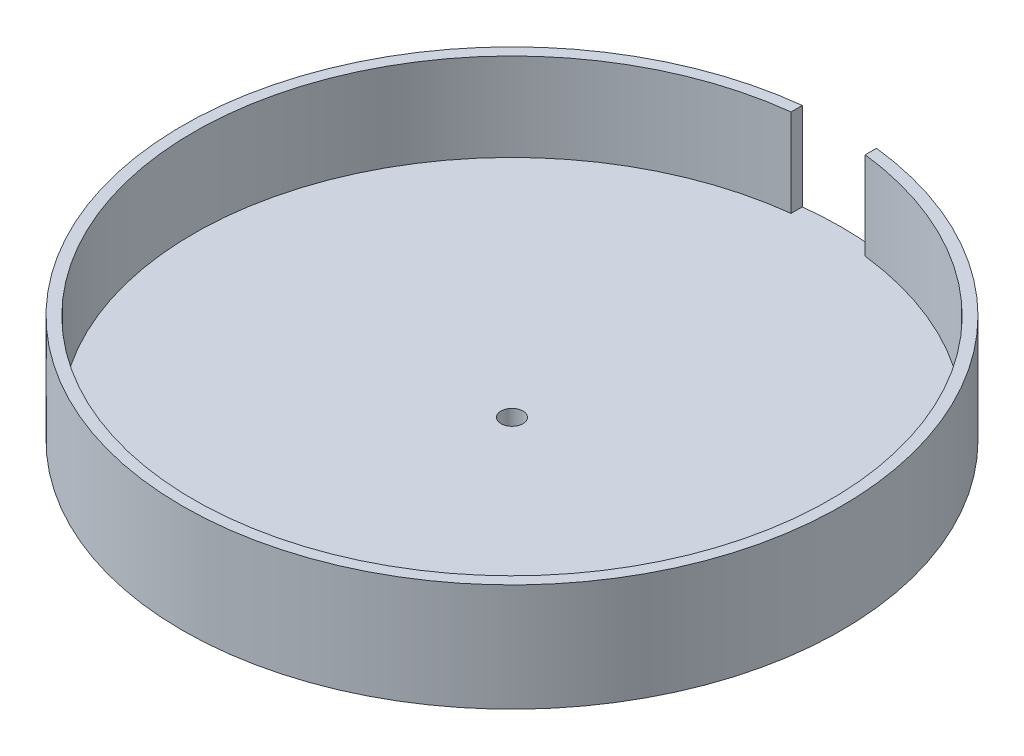
ISO-10303-21;
HEADER;
FILE_DESCRIPTION(('STEP AP214'),'2;1');
FILE_NAME('part.step','',(''),(''),'','','');
FILE_SCHEMA(('AUTOMOTIVE_DESIGN { 1 0 10303 214 1 1 1 1 }'));
ENDSEC;
DATA;
#1=APPLICATION_CONTEXT('core data for automotive mechanical design processes');
#2=APPLICATION_PROTOCOL_DEFINITION('international standard','automotive_design',2000,#1);
#3=PRODUCT_CONTEXT('',#1,'mechanical');
#4=PRODUCT('Part','Part','',(#3));
#5=PRODUCT_RELATED_PRODUCT_CATEGORY('part','',(#4));
#6=PRODUCT_DEFINITION_FORMATION('','',#4);
#7=PRODUCT_DEFINITION_CONTEXT('part definition',#1,'design');
#8=PRODUCT_DEFINITION('design','',#6,#7);
#9=PRODUCT_DEFINITION_SHAPE('','',#8);
#10=(LENGTH_UNIT() NAMED_UNIT(*) SI_UNIT(.MILLI.,.METRE.));
#11=(NAMED_UNIT(*) PLANE_ANGLE_UNIT() SI_UNIT($,.RADIAN.));
#12=(NAMED_UNIT(*) SI_UNIT($,.STERADIAN.) SOLID_ANGLE_UNIT());
#13=UNCERTAINTY_MEASURE_WITH_UNIT(LENGTH_MEASURE(1.E-05),#10,'distance_accuracy_value','');
#14=(GEOMETRIC_REPRESENTATION_CONTEXT(3) GLOBAL_UNCERTAINTY_ASSIGNED_CONTEXT((#13)) GLOBAL_UNIT_ASSIGNED_CONTEXT((#10,
#11,#12)) REPRESENTATION_CONTEXT('',''));
#15=CARTESIAN_POINT('',(0.,0.,0.));
#16=DIRECTION('',(0.,0.,1.));
#17=DIRECTION('',(1.,0.,0.));
#18=AXIS2_PLACEMENT_3D('',#15,#16,#17);
#19=CARTESIAN_POINT('',(0.,0.,0.));
#20=DIRECTION('',(0.,1.,0.));
#21=DIRECTION('',(0.,0.,1.));
#22=AXIS2_PLACEMENT_3D('',#19,#20,#21);
#23=PLANE('',#22);
#24=CARTESIAN_POINT('',(0.,0.,0.));
#25=DIRECTION('',(0.,1.,0.));
#26=DIRECTION('',(0.,0.,1.));
#27=AXIS2_PLACEMENT_3D('',#24,#25,#26);
#28=CIRCLE('',#27,150.);
#29=CARTESIAN_POINT('',(0.,0.,150.));
#30=VERTEX_POINT('',#29);
#31=EDGE_CURVE('E12',#30,#30,#28,.T.);
#32=ORIENTED_EDGE('',*,*,#31,.F.);
#33=EDGE_LOOP('',(#32));
#34=FACE_BOUND('',#33,.T.);
#35=CARTESIAN_POINT('',(0.,0.,0.));
#36=DIRECTION('',(0.,1.,0.));
#37=DIRECTION('',(0.,0.,1.));
#38=AXIS2_PLACEMENT_3D('',#35,#36,#37);
#39=CIRCLE('',#38,5.);
#40=CARTESIAN_POINT('',(0.,0.,5.));
#41=VERTEX_POINT('',#40);
#42=EDGE_CURVE('E55',#41,#41,#39,.T.);
#43=ORIENTED_EDGE('',*,*,#42,.T.);
#44=EDGE_LOOP('',(#43));
#45=FACE_BOUND('',#44,.T.);
#46=ADVANCED_FACE('F42',(#34,#45),#23,.F.);
#47=CARTESIAN_POINT('',(0.,8.99999999999997,0.));
#48=DIRECTION('',(0.,-1.,0.));
#49=DIRECTION('',(0.,0.,-1.));
#50=AXIS2_PLACEMENT_3D('',#47,#48,#49);
#51=CYLINDRICAL_SURFACE('',#50,150.);
#52=ORIENTED_EDGE('',*,*,#31,.T.);
#53=EDGE_LOOP('',(#52));
#54=FACE_BOUND('',#53,.T.);
#55=CARTESIAN_POINT('',(0.,8.99999999999997,0.));
#56=DIRECTION('',(0.,1.,0.));
#57=DIRECTION('',(0.,0.,1.));
#58=AXIS2_PLACEMENT_3D('',#55,#56,#57);
#59=CIRCLE('',#58,150.);
#60=CARTESIAN_POINT('',(16.8870802316767,8.99999999999997,-149.046390500572));
#61=VERTEX_POINT('',#60);
#62=CARTESIAN_POINT('',(-16.8870802316767,8.99999999999997,-149.046390500572));
#63=VERTEX_POINT('',#62);
#64=EDGE_CURVE('E95',#61,#63,#59,.T.);
#65=ORIENTED_EDGE('',*,*,#64,.F.);
#66=DIRECTION('',(0.,-1.,0.));
#67=VECTOR('',#66,1.);
#68=CARTESIAN_POINT('',(16.8870802316767,8.99999999999997,-149.046390500572));
#69=LINE('',#68,#67);
#70=CARTESIAN_POINT('',(16.8870802316767,49.,-149.046390500572));
#71=VERTEX_POINT('',#70);
#72=EDGE_CURVE('E70',#61,#71,#69,.F.);
#73=ORIENTED_EDGE('',*,*,#72,.T.);
#74=CARTESIAN_POINT('',(0.,49.,0.));
#75=DIRECTION('',(0.,1.,0.));
#76=DIRECTION('',(0.,0.,1.));
#77=AXIS2_PLACEMENT_3D('',#74,#75,#76);
#78=CIRCLE('',#77,150.);
#79=CARTESIAN_POINT('',(-16.8870802316767,49.,-149.046390500572));
#80=VERTEX_POINT('',#79);
#81=EDGE_CURVE('E108',#80,#71,#78,.T.);
#82=ORIENTED_EDGE('',*,*,#81,.F.);
#83=DIRECTION('',(0.,-1.,0.));
#84=VECTOR('',#83,1.);
#85=CARTESIAN_POINT('',(-16.8870802316767,8.99999999999997,-149.046390500572));
#86=LINE('',#85,#84);
#87=EDGE_CURVE('E138',#80,#63,#86,.T.);
#88=ORIENTED_EDGE('',*,*,#87,.T.);
#89=EDGE_LOOP('',(#65,#73,#82,#88));
#90=FACE_BOUND('',#89,.T.);
#91=ADVANCED_FACE('F46',(#54,#90),#51,.T.);
#92=CARTESIAN_POINT('',(0.,8.99999999999997,0.));
#93=DIRECTION('',(0.,-1.,0.));
#94=DIRECTION('',(0.,0.,-1.));
#95=AXIS2_PLACEMENT_3D('',#92,#93,#94);
#96=CYLINDRICAL_SURFACE('',#95,5.);
#97=CARTESIAN_POINT('',(0.,8.99999999999997,0.));
#98=DIRECTION('',(0.,1.,0.));
#99=DIRECTION('',(0.,0.,1.));
#100=AXIS2_PLACEMENT_3D('',#97,#98,#99);
#101=CIRCLE('',#100,5.);
#102=CARTESIAN_POINT('',(0.,8.99999999999997,5.));
#103=VERTEX_POINT('',#102);
#104=EDGE_CURVE('E104',#103,#103,#101,.T.);
#105=ORIENTED_EDGE('',*,*,#104,.T.);
#106=EDGE_LOOP('',(#105));
#107=FACE_BOUND('',#106,.T.);
#108=ORIENTED_EDGE('',*,*,#42,.F.);
#109=EDGE_LOOP('',(#108));
#110=FACE_BOUND('',#109,.T.);
#111=ADVANCED_FACE('F119',(#107,#110),#96,.F.);
#112=CARTESIAN_POINT('',(0.,49.,0.));
#113=DIRECTION('',(0.,1.,0.));
#114=DIRECTION('',(0.,0.,1.));
#115=AXIS2_PLACEMENT_3D('',#112,#113,#114);
#116=PLANE('',#115);
#117=DIRECTION('',(0.,0.,-1.));
#118=VECTOR('',#117,1.);
#119=CARTESIAN_POINT('',(16.8870802316767,49.,-156.08035298411));
#120=LINE('',#119,#118);
#121=CARTESIAN_POINT('',(16.8870802316767,49.,-143.91964701589));
#122=VERTEX_POINT('',#121);
#123=EDGE_CURVE('E145',#122,#71,#120,.T.);
#124=ORIENTED_EDGE('',*,*,#123,.F.);
#125=CARTESIAN_POINT('',(0.,49.,0.));
#126=DIRECTION('',(0.,1.,0.));
#127=DIRECTION('',(0.,0.,1.));
#128=AXIS2_PLACEMENT_3D('',#125,#126,#127);
#129=CIRCLE('',#128,144.906998712724);
#130=CARTESIAN_POINT('',(-16.8870802316767,49.,-143.91964701589));
#131=VERTEX_POINT('',#130);
#132=EDGE_CURVE('E106',#131,#122,#129,.T.);
#133=ORIENTED_EDGE('',*,*,#132,.F.);
#134=DIRECTION('',(0.,0.,1.));
#135=VECTOR('',#134,1.);
#136=CARTESIAN_POINT('',(-16.8870802316767,49.,-156.08035298411));
#137=LINE('',#136,#135);
#138=EDGE_CURVE('E56',#80,#131,#137,.T.);
#139=ORIENTED_EDGE('',*,*,#138,.F.);
#140=ORIENTED_EDGE('',*,*,#81,.T.);
#141=EDGE_LOOP('',(#124,#133,#139,#140));
#142=FACE_BOUND('',#141,.T.);
#143=ADVANCED_FACE('F125',(#142),#116,.T.);
#144=CARTESIAN_POINT('',(0.,8.99999999999997,0.));
#145=DIRECTION('',(0.,1.,0.));
#146=DIRECTION('',(0.,0.,1.));
#147=AXIS2_PLACEMENT_3D('',#144,#145,#146);
#148=CYLINDRICAL_SURFACE('',#147,144.906998712724);
#149=ORIENTED_EDGE('',*,*,#132,.T.);
#150=DIRECTION('',(0.,1.,0.));
#151=VECTOR('',#150,1.);
#152=CARTESIAN_POINT('',(16.8870802316767,8.99999999999997,-143.91964701589));
#153=LINE('',#152,#151);
#154=CARTESIAN_POINT('',(16.8870802316767,8.99999999999997,-143.91964701589));
#155=VERTEX_POINT('',#154);
#156=EDGE_CURVE('E101',#155,#122,#153,.T.);
#157=ORIENTED_EDGE('',*,*,#156,.F.);
#158=CARTESIAN_POINT('',(0.,8.99999999999997,0.));
#159=DIRECTION('',(0.,1.,0.));
#160=DIRECTION('',(0.,0.,1.));
#161=AXIS2_PLACEMENT_3D('',#158,#159,#160);
#162=CIRCLE('',#161,144.906998712724);
#163=CARTESIAN_POINT('',(-16.8870802316767,8.99999999999997,-143.91964701589));
#164=VERTEX_POINT('',#163);
#165=EDGE_CURVE('E89',#164,#155,#162,.T.);
#166=ORIENTED_EDGE('',*,*,#165,.F.);
#167=DIRECTION('',(0.,1.,0.));
#168=VECTOR('',#167,1.);
#169=CARTESIAN_POINT('',(-16.8870802316767,8.99999999999997,-143.91964701589));
#170=LINE('',#169,#168);
#171=EDGE_CURVE('E94',#164,#131,#170,.T.);
#172=ORIENTED_EDGE('',*,*,#171,.T.);
#173=EDGE_LOOP('',(#149,#157,#166,#172));
#174=FACE_BOUND('',#173,.T.);
#175=ADVANCED_FACE('F102',(#174),#148,.F.);
#176=CARTESIAN_POINT('',(0.,8.99999999999997,0.));
#177=DIRECTION('',(0.,1.,0.));
#178=DIRECTION('',(0.,0.,1.));
#179=AXIS2_PLACEMENT_3D('',#176,#177,#178);
#180=PLANE('',#179);
#181=ORIENTED_EDGE('',*,*,#165,.T.);
#182=DIRECTION('',(0.,0.,-1.));
#183=VECTOR('',#182,1.);
#184=CARTESIAN_POINT('',(16.8870802316767,8.99999999999997,-156.08035298411));
#185=LINE('',#184,#183);
#186=EDGE_CURVE('E92',#155,#61,#185,.T.);
#187=ORIENTED_EDGE('',*,*,#186,.T.);
#188=ORIENTED_EDGE('',*,*,#64,.T.);
#189=DIRECTION('',(0.,0.,1.));
#190=VECTOR('',#189,1.);
#191=CARTESIAN_POINT('',(-16.8870802316767,8.99999999999997,-156.08035298411));
#192=LINE('',#191,#190);
#193=EDGE_CURVE('E88',#63,#164,#192,.T.);
#194=ORIENTED_EDGE('',*,*,#193,.T.);
#195=EDGE_LOOP('',(#181,#187,#188,#194));
#196=FACE_BOUND('',#195,.T.);
#197=ORIENTED_EDGE('',*,*,#104,.F.);
#198=EDGE_LOOP('',(#197));
#199=FACE_BOUND('',#198,.T.);
#200=ADVANCED_FACE('F87',(#196,#199),#180,.T.);
#201=CARTESIAN_POINT('',(16.8870802316767,8.99999999999997,-156.08035298411));
#202=DIRECTION('',(1.,0.,0.));
#203=DIRECTION('',(0.,0.,-1.));
#204=AXIS2_PLACEMENT_3D('',#201,#202,#203);
#205=PLANE('',#204);
#206=ORIENTED_EDGE('',*,*,#186,.F.);
#207=ORIENTED_EDGE('',*,*,#156,.T.);
#208=ORIENTED_EDGE('',*,*,#123,.T.);
#209=ORIENTED_EDGE('',*,*,#72,.F.);
#210=EDGE_LOOP('',(#206,#207,#208,#209));
#211=FACE_BOUND('',#210,.T.);
#212=ADVANCED_FACE('F148',(#211),#205,.F.);
#213=CARTESIAN_POINT('',(-16.8870802316767,8.99999999999997,-156.08035298411));
#214=DIRECTION('',(-1.,0.,0.));
#215=DIRECTION('',(0.,0.,1.));
#216=AXIS2_PLACEMENT_3D('',#213,#214,#215);
#217=PLANE('',#216);
#218=ORIENTED_EDGE('',*,*,#138,.T.);
#219=ORIENTED_EDGE('',*,*,#171,.F.);
#220=ORIENTED_EDGE('',*,*,#193,.F.);
#221=ORIENTED_EDGE('',*,*,#87,.F.);
#222=EDGE_LOOP('',(#218,#219,#220,#221));
#223=FACE_BOUND('',#222,.T.);
#224=ADVANCED_FACE('F100',(#223),#217,.F.);
#225=CLOSED_SHELL('',(#46,#91,#111,#143,#175,#200,#212,#224));
#226=MANIFOLD_SOLID_BREP('B2',#225);
#227=ADVANCED_BREP_SHAPE_REPRESENTATION('',(#18,#226),#14);
#228=SHAPE_DEFINITION_REPRESENTATION(#9,#227);
ENDSEC;
END-ISO-10303-21;
